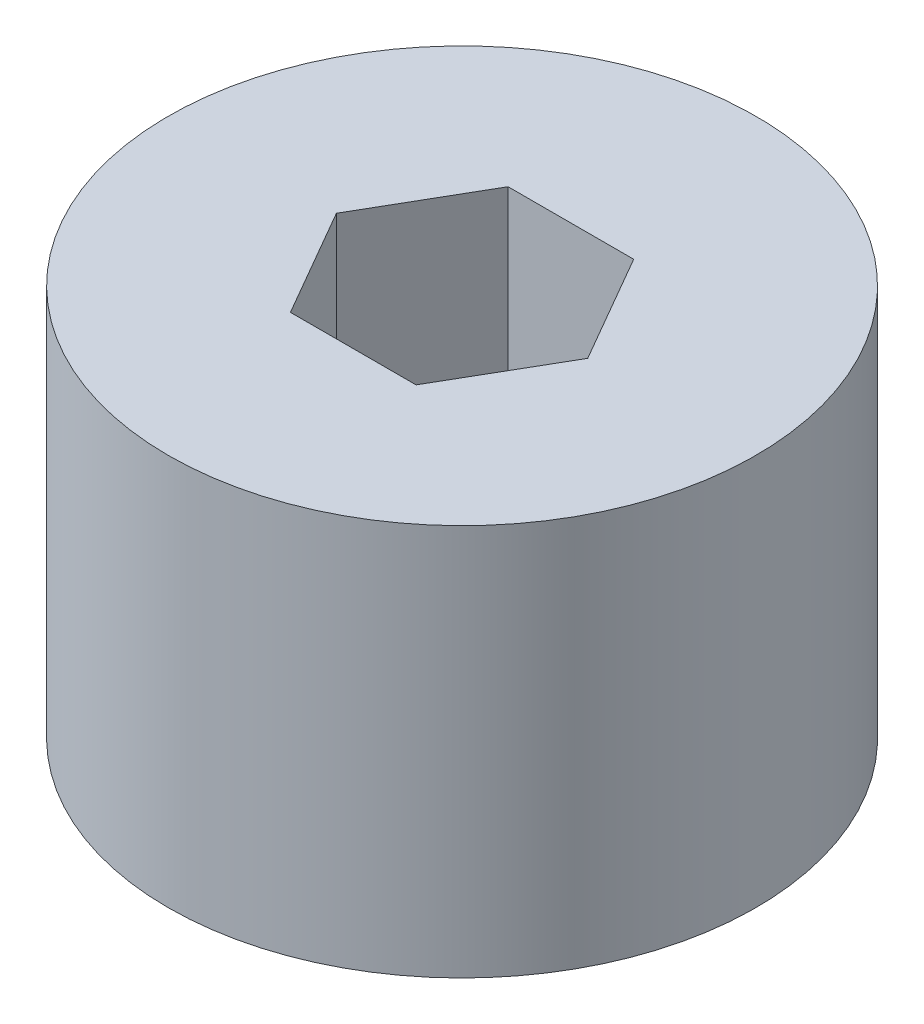
ISO-10303-21;
HEADER;
FILE_DESCRIPTION(('STEP AP214'),'2;1');
FILE_NAME('part.step','',(''),(''),'','','');
FILE_SCHEMA(('AUTOMOTIVE_DESIGN { 1 0 10303 214 1 1 1 1 }'));
ENDSEC;
DATA;
#1=APPLICATION_CONTEXT('core data for automotive mechanical design processes');
#2=APPLICATION_PROTOCOL_DEFINITION('international standard','automotive_design',2000,#1);
#3=PRODUCT_CONTEXT('',#1,'mechanical');
#4=PRODUCT('Part','Part','',(#3));
#5=PRODUCT_RELATED_PRODUCT_CATEGORY('part','',(#4));
#6=PRODUCT_DEFINITION_FORMATION('','',#4);
#7=PRODUCT_DEFINITION_CONTEXT('part definition',#1,'design');
#8=PRODUCT_DEFINITION('design','',#6,#7);
#9=PRODUCT_DEFINITION_SHAPE('','',#8);
#10=(LENGTH_UNIT() NAMED_UNIT(*) SI_UNIT(.MILLI.,.METRE.));
#11=(NAMED_UNIT(*) PLANE_ANGLE_UNIT() SI_UNIT($,.RADIAN.));
#12=(NAMED_UNIT(*) SI_UNIT($,.STERADIAN.) SOLID_ANGLE_UNIT());
#13=UNCERTAINTY_MEASURE_WITH_UNIT(LENGTH_MEASURE(1.E-05),#10,'distance_accuracy_value','');
#14=(GEOMETRIC_REPRESENTATION_CONTEXT(3) GLOBAL_UNCERTAINTY_ASSIGNED_CONTEXT((#13)) GLOBAL_UNIT_ASSIGNED_CONTEXT((#10,
#11,#12)) REPRESENTATION_CONTEXT('',''));
#15=CARTESIAN_POINT('',(0.,0.,0.));
#16=DIRECTION('',(0.,0.,1.));
#17=DIRECTION('',(1.,0.,0.));
#18=AXIS2_PLACEMENT_3D('',#15,#16,#17);
#19=CARTESIAN_POINT('',(0.,22.86,0.));
#20=DIRECTION('',(0.,1.,0.));
#21=DIRECTION('',(0.,0.,1.));
#22=AXIS2_PLACEMENT_3D('',#19,#20,#21);
#23=PLANE('',#22);
#24=CARTESIAN_POINT('',(0.,22.86,0.));
#25=DIRECTION('',(0.,1.,0.));
#26=DIRECTION('',(0.,0.,1.));
#27=AXIS2_PLACEMENT_3D('',#24,#25,#26);
#28=CIRCLE('',#27,17.145);
#29=CARTESIAN_POINT('',(0.,22.86,17.145));
#30=VERTEX_POINT('',#29);
#31=EDGE_CURVE('E11',#30,#30,#28,.T.);
#32=ORIENTED_EDGE('',*,*,#31,.T.);
#33=EDGE_LOOP('',(#32));
#34=FACE_BOUND('',#33,.T.);
#35=DIRECTION('',(-0.5,0.,-0.866025403784438));
#36=VECTOR('',#35,1.);
#37=CARTESIAN_POINT('',(7.33234841870825,22.86,0.));
#38=LINE('',#37,#36);
#39=CARTESIAN_POINT('',(7.33234841870825,22.86,0.));
#40=VERTEX_POINT('',#39);
#41=CARTESIAN_POINT('',(3.66617420935412,22.86,-6.35));
#42=VERTEX_POINT('',#41);
#43=EDGE_CURVE('E124',#40,#42,#38,.T.);
#44=ORIENTED_EDGE('',*,*,#43,.F.);
#45=DIRECTION('',(0.5,0.,-0.866025403784439));
#46=VECTOR('',#45,1.);
#47=CARTESIAN_POINT('',(3.66617420935413,22.86,6.35));
#48=LINE('',#47,#46);
#49=CARTESIAN_POINT('',(3.66617420935413,22.86,6.35));
#50=VERTEX_POINT('',#49);
#51=EDGE_CURVE('E122',#50,#40,#48,.T.);
#52=ORIENTED_EDGE('',*,*,#51,.F.);
#53=DIRECTION('',(1.,0.,0.));
#54=VECTOR('',#53,1.);
#55=CARTESIAN_POINT('',(-3.66617420935412,22.86,6.35));
#56=LINE('',#55,#54);
#57=CARTESIAN_POINT('',(-3.66617420935412,22.86,6.35));
#58=VERTEX_POINT('',#57);
#59=EDGE_CURVE('E100',#58,#50,#56,.T.);
#60=ORIENTED_EDGE('',*,*,#59,.F.);
#61=DIRECTION('',(0.5,0.,0.866025403784438));
#62=VECTOR('',#61,1.);
#63=CARTESIAN_POINT('',(-7.33234841870825,22.86,0.));
#64=LINE('',#63,#62);
#65=CARTESIAN_POINT('',(-7.33234841870825,22.86,0.));
#66=VERTEX_POINT('',#65);
#67=EDGE_CURVE('E130',#66,#58,#64,.T.);
#68=ORIENTED_EDGE('',*,*,#67,.F.);
#69=DIRECTION('',(-0.5,0.,0.866025403784438));
#70=VECTOR('',#69,1.);
#71=CARTESIAN_POINT('',(-3.66617420935412,22.86,-6.35));
#72=LINE('',#71,#70);
#73=CARTESIAN_POINT('',(-3.66617420935412,22.86,-6.35));
#74=VERTEX_POINT('',#73);
#75=EDGE_CURVE('E128',#74,#66,#72,.T.);
#76=ORIENTED_EDGE('',*,*,#75,.F.);
#77=DIRECTION('',(-1.,0.,0.));
#78=VECTOR('',#77,1.);
#79=CARTESIAN_POINT('',(3.66617420935412,22.86,-6.35));
#80=LINE('',#79,#78);
#81=EDGE_CURVE('E126',#42,#74,#80,.T.);
#82=ORIENTED_EDGE('',*,*,#81,.F.);
#83=EDGE_LOOP('',(#44,#52,#60,#68,#76,#82));
#84=FACE_BOUND('',#83,.T.);
#85=ADVANCED_FACE('F38',(#34,#84),#23,.T.);
#86=CARTESIAN_POINT('',(0.,0.,0.));
#87=DIRECTION('',(0.,1.,0.));
#88=DIRECTION('',(0.,0.,1.));
#89=AXIS2_PLACEMENT_3D('',#86,#87,#88);
#90=PLANE('',#89);
#91=CARTESIAN_POINT('',(0.,0.,0.));
#92=DIRECTION('',(0.,1.,0.));
#93=DIRECTION('',(0.,0.,1.));
#94=AXIS2_PLACEMENT_3D('',#91,#92,#93);
#95=CIRCLE('',#94,17.145);
#96=CARTESIAN_POINT('',(0.,0.,17.145));
#97=VERTEX_POINT('',#96);
#98=EDGE_CURVE('E42',#97,#97,#95,.T.);
#99=ORIENTED_EDGE('',*,*,#98,.F.);
#100=EDGE_LOOP('',(#99));
#101=FACE_BOUND('',#100,.T.);
#102=ADVANCED_FACE('F146',(#101),#90,.F.);
#103=CARTESIAN_POINT('',(0.,22.86,0.));
#104=DIRECTION('',(0.,-1.,0.));
#105=DIRECTION('',(0.,0.,-1.));
#106=AXIS2_PLACEMENT_3D('',#103,#104,#105);
#107=CYLINDRICAL_SURFACE('',#106,17.145);
#108=ORIENTED_EDGE('',*,*,#31,.F.);
#109=EDGE_LOOP('',(#108));
#110=FACE_BOUND('',#109,.T.);
#111=ORIENTED_EDGE('',*,*,#98,.T.);
#112=EDGE_LOOP('',(#111));
#113=FACE_BOUND('',#112,.T.);
#114=ADVANCED_FACE('F40',(#110,#113),#107,.T.);
#115=CARTESIAN_POINT('',(3.66617420935413,22.86,6.35));
#116=DIRECTION('',(-0.866025403784439,0.,-0.5));
#117=DIRECTION('',(-0.5,0.,0.866025403784439));
#118=AXIS2_PLACEMENT_3D('',#115,#116,#117);
#119=PLANE('',#118);
#120=DIRECTION('',(0.5,0.,-0.866025403784439));
#121=VECTOR('',#120,1.);
#122=CARTESIAN_POINT('',(5.49926131403119,6.35,3.175));
#123=LINE('',#122,#121);
#124=CARTESIAN_POINT('',(3.66617420935413,6.35,6.35));
#125=VERTEX_POINT('',#124);
#126=CARTESIAN_POINT('',(7.33234841870825,6.35,0.));
#127=VERTEX_POINT('',#126);
#128=EDGE_CURVE('E106',#125,#127,#123,.T.);
#129=ORIENTED_EDGE('',*,*,#128,.F.);
#130=DIRECTION('',(0.,-1.,0.));
#131=VECTOR('',#130,1.);
#132=CARTESIAN_POINT('',(3.66617420935413,22.86,6.35));
#133=LINE('',#132,#131);
#134=EDGE_CURVE('E93',#50,#125,#133,.T.);
#135=ORIENTED_EDGE('',*,*,#134,.F.);
#136=ORIENTED_EDGE('',*,*,#51,.T.);
#137=DIRECTION('',(0.,-1.,0.));
#138=VECTOR('',#137,1.);
#139=CARTESIAN_POINT('',(7.33234841870825,22.86,0.));
#140=LINE('',#139,#138);
#141=EDGE_CURVE('E108',#40,#127,#140,.T.);
#142=ORIENTED_EDGE('',*,*,#141,.T.);
#143=EDGE_LOOP('',(#129,#135,#136,#142));
#144=FACE_BOUND('',#143,.T.);
#145=ADVANCED_FACE('F107',(#144),#119,.T.);
#146=CARTESIAN_POINT('',(7.33234841870825,22.86,0.));
#147=DIRECTION('',(-0.866025403784438,0.,0.5));
#148=DIRECTION('',(0.5,0.,0.866025403784439));
#149=AXIS2_PLACEMENT_3D('',#146,#147,#148);
#150=PLANE('',#149);
#151=DIRECTION('',(-0.5,0.,-0.866025403784438));
#152=VECTOR('',#151,1.);
#153=CARTESIAN_POINT('',(5.49926131403118,6.35,-3.175));
#154=LINE('',#153,#152);
#155=CARTESIAN_POINT('',(3.66617420935412,6.35,-6.35));
#156=VERTEX_POINT('',#155);
#157=EDGE_CURVE('E53',#127,#156,#154,.T.);
#158=ORIENTED_EDGE('',*,*,#157,.F.);
#159=ORIENTED_EDGE('',*,*,#141,.F.);
#160=ORIENTED_EDGE('',*,*,#43,.T.);
#161=DIRECTION('',(0.,-1.,0.));
#162=VECTOR('',#161,1.);
#163=CARTESIAN_POINT('',(3.66617420935412,22.86,-6.35));
#164=LINE('',#163,#162);
#165=EDGE_CURVE('E140',#42,#156,#164,.T.);
#166=ORIENTED_EDGE('',*,*,#165,.T.);
#167=EDGE_LOOP('',(#158,#159,#160,#166));
#168=FACE_BOUND('',#167,.T.);
#169=ADVANCED_FACE('F158',(#168),#150,.T.);
#170=CARTESIAN_POINT('',(3.66617420935412,22.86,-6.35));
#171=DIRECTION('',(0.,0.,1.));
#172=DIRECTION('',(1.,0.,0.));
#173=AXIS2_PLACEMENT_3D('',#170,#171,#172);
#174=PLANE('',#173);
#175=DIRECTION('',(-1.,0.,0.));
#176=VECTOR('',#175,1.);
#177=CARTESIAN_POINT('',(0.,6.35,-6.35));
#178=LINE('',#177,#176);
#179=CARTESIAN_POINT('',(-3.66617420935412,6.35,-6.35));
#180=VERTEX_POINT('',#179);
#181=EDGE_CURVE('E61',#156,#180,#178,.T.);
#182=ORIENTED_EDGE('',*,*,#181,.F.);
#183=ORIENTED_EDGE('',*,*,#165,.F.);
#184=ORIENTED_EDGE('',*,*,#81,.T.);
#185=DIRECTION('',(0.,-1.,0.));
#186=VECTOR('',#185,1.);
#187=CARTESIAN_POINT('',(-3.66617420935412,22.86,-6.35));
#188=LINE('',#187,#186);
#189=EDGE_CURVE('E138',#74,#180,#188,.T.);
#190=ORIENTED_EDGE('',*,*,#189,.T.);
#191=EDGE_LOOP('',(#182,#183,#184,#190));
#192=FACE_BOUND('',#191,.T.);
#193=ADVANCED_FACE('F161',(#192),#174,.T.);
#194=CARTESIAN_POINT('',(-3.66617420935412,22.86,-6.35));
#195=DIRECTION('',(0.866025403784439,0.,0.5));
#196=DIRECTION('',(0.5,0.,-0.866025403784439));
#197=AXIS2_PLACEMENT_3D('',#194,#195,#196);
#198=PLANE('',#197);
#199=DIRECTION('',(-0.5,0.,0.866025403784439));
#200=VECTOR('',#199,1.);
#201=CARTESIAN_POINT('',(-5.49926131403118,6.35,-3.175));
#202=LINE('',#201,#200);
#203=CARTESIAN_POINT('',(-7.33234841870825,6.35,0.));
#204=VERTEX_POINT('',#203);
#205=EDGE_CURVE('E119',#180,#204,#202,.T.);
#206=ORIENTED_EDGE('',*,*,#205,.F.);
#207=ORIENTED_EDGE('',*,*,#189,.F.);
#208=ORIENTED_EDGE('',*,*,#75,.T.);
#209=DIRECTION('',(0.,-1.,0.));
#210=VECTOR('',#209,1.);
#211=CARTESIAN_POINT('',(-7.33234841870825,22.86,0.));
#212=LINE('',#211,#210);
#213=EDGE_CURVE('E135',#66,#204,#212,.T.);
#214=ORIENTED_EDGE('',*,*,#213,.T.);
#215=EDGE_LOOP('',(#206,#207,#208,#214));
#216=FACE_BOUND('',#215,.T.);
#217=ADVANCED_FACE('F164',(#216),#198,.T.);
#218=CARTESIAN_POINT('',(-7.33234841870825,22.86,0.));
#219=DIRECTION('',(0.866025403784438,0.,-0.5));
#220=DIRECTION('',(-0.5,0.,-0.866025403784438));
#221=AXIS2_PLACEMENT_3D('',#218,#219,#220);
#222=PLANE('',#221);
#223=DIRECTION('',(0.5,0.,0.866025403784438));
#224=VECTOR('',#223,1.);
#225=CARTESIAN_POINT('',(-5.49926131403118,6.35,3.175));
#226=LINE('',#225,#224);
#227=CARTESIAN_POINT('',(-3.66617420935412,6.35,6.35));
#228=VERTEX_POINT('',#227);
#229=EDGE_CURVE('E114',#204,#228,#226,.T.);
#230=ORIENTED_EDGE('',*,*,#229,.F.);
#231=ORIENTED_EDGE('',*,*,#213,.F.);
#232=ORIENTED_EDGE('',*,*,#67,.T.);
#233=DIRECTION('',(0.,-1.,0.));
#234=VECTOR('',#233,1.);
#235=CARTESIAN_POINT('',(-3.66617420935412,22.86,6.35));
#236=LINE('',#235,#234);
#237=EDGE_CURVE('E103',#58,#228,#236,.T.);
#238=ORIENTED_EDGE('',*,*,#237,.T.);
#239=EDGE_LOOP('',(#230,#231,#232,#238));
#240=FACE_BOUND('',#239,.T.);
#241=ADVANCED_FACE('F167',(#240),#222,.T.);
#242=CARTESIAN_POINT('',(-3.66617420935412,22.86,6.35));
#243=DIRECTION('',(0.,0.,-1.));
#244=DIRECTION('',(-1.,0.,0.));
#245=AXIS2_PLACEMENT_3D('',#242,#243,#244);
#246=PLANE('',#245);
#247=DIRECTION('',(1.,0.,0.));
#248=VECTOR('',#247,1.);
#249=CARTESIAN_POINT('',(0.,6.35,6.35));
#250=LINE('',#249,#248);
#251=EDGE_CURVE('E97',#228,#125,#250,.T.);
#252=ORIENTED_EDGE('',*,*,#251,.F.);
#253=ORIENTED_EDGE('',*,*,#237,.F.);
#254=ORIENTED_EDGE('',*,*,#59,.T.);
#255=ORIENTED_EDGE('',*,*,#134,.T.);
#256=EDGE_LOOP('',(#252,#253,#254,#255));
#257=FACE_BOUND('',#256,.T.);
#258=ADVANCED_FACE('F95',(#257),#246,.T.);
#259=CARTESIAN_POINT('',(0.,6.35,0.));
#260=DIRECTION('',(0.,1.,0.));
#261=DIRECTION('',(0.,0.,1.));
#262=AXIS2_PLACEMENT_3D('',#259,#260,#261);
#263=PLANE('',#262);
#264=ORIENTED_EDGE('',*,*,#251,.T.);
#265=ORIENTED_EDGE('',*,*,#128,.T.);
#266=ORIENTED_EDGE('',*,*,#157,.T.);
#267=ORIENTED_EDGE('',*,*,#181,.T.);
#268=ORIENTED_EDGE('',*,*,#205,.T.);
#269=ORIENTED_EDGE('',*,*,#229,.T.);
#270=EDGE_LOOP('',(#264,#265,#266,#267,#268,#269));
#271=FACE_BOUND('',#270,.T.);
#272=ADVANCED_FACE('F112',(#271),#263,.T.);
#273=CLOSED_SHELL('',(#85,#102,#114,#145,#169,#193,#217,#241,#258,#272));
#274=MANIFOLD_SOLID_BREP('B2',#273);
#275=ADVANCED_BREP_SHAPE_REPRESENTATION('',(#18,#274),#14);
#276=SHAPE_DEFINITION_REPRESENTATION(#9,#275);
ENDSEC;
END-ISO-10303-21;
